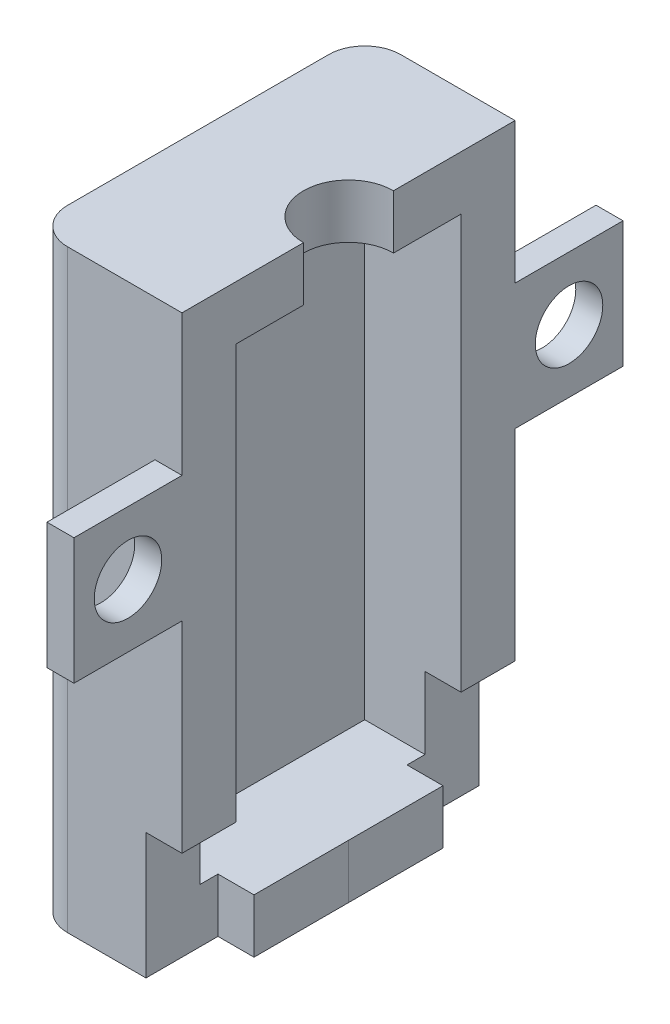
ISO-10303-21;
HEADER;
FILE_DESCRIPTION(('STEP AP214'),'2;1');
FILE_NAME('part.step','',(''),(''),'','','');
FILE_SCHEMA(('AUTOMOTIVE_DESIGN { 1 0 10303 214 1 1 1 1 }'));
ENDSEC;
DATA;
#1=APPLICATION_CONTEXT('core data for automotive mechanical design processes');
#2=APPLICATION_PROTOCOL_DEFINITION('international standard','automotive_design',2000,#1);
#3=PRODUCT_CONTEXT('',#1,'mechanical');
#4=PRODUCT('Part','Part','',(#3));
#5=PRODUCT_RELATED_PRODUCT_CATEGORY('part','',(#4));
#6=PRODUCT_DEFINITION_FORMATION('','',#4);
#7=PRODUCT_DEFINITION_CONTEXT('part definition',#1,'design');
#8=PRODUCT_DEFINITION('design','',#6,#7);
#9=PRODUCT_DEFINITION_SHAPE('','',#8);
#10=(LENGTH_UNIT() NAMED_UNIT(*) SI_UNIT(.MILLI.,.METRE.));
#11=(NAMED_UNIT(*) PLANE_ANGLE_UNIT() SI_UNIT($,.RADIAN.));
#12=(NAMED_UNIT(*) SI_UNIT($,.STERADIAN.) SOLID_ANGLE_UNIT());
#13=UNCERTAINTY_MEASURE_WITH_UNIT(LENGTH_MEASURE(1.E-05),#10,'distance_accuracy_value','');
#14=(GEOMETRIC_REPRESENTATION_CONTEXT(3) GLOBAL_UNCERTAINTY_ASSIGNED_CONTEXT((#13)) GLOBAL_UNIT_ASSIGNED_CONTEXT((#10,
#11,#12)) REPRESENTATION_CONTEXT('',''));
#15=CARTESIAN_POINT('',(0.,0.,0.));
#16=DIRECTION('',(0.,0.,1.));
#17=DIRECTION('',(1.,0.,0.));
#18=AXIS2_PLACEMENT_3D('',#15,#16,#17);
#19=CARTESIAN_POINT('',(-8.35,3.,9.25));
#20=DIRECTION('',(0.,0.,-1.));
#21=DIRECTION('',(-1.,0.,0.));
#22=AXIS2_PLACEMENT_3D('',#19,#20,#21);
#23=PLANE('',#22);
#24=DIRECTION('',(0.,-1.,0.));
#25=VECTOR('',#24,1.);
#26=CARTESIAN_POINT('',(0.,3.,9.25));
#27=LINE('',#26,#25);
#28=CARTESIAN_POINT('',(0.,33.,9.25));
#29=VERTEX_POINT('',#28);
#30=CARTESIAN_POINT('',(0.,25.1794134746916,9.25));
#31=VERTEX_POINT('',#30);
#32=EDGE_CURVE('E414',#29,#31,#27,.T.);
#33=ORIENTED_EDGE('',*,*,#32,.F.);
#34=DIRECTION('',(1.,0.,0.));
#35=VECTOR('',#34,1.);
#36=CARTESIAN_POINT('',(-8.35,33.,9.25));
#37=LINE('',#36,#35);
#38=CARTESIAN_POINT('',(-6.35,33.,9.25));
#39=VERTEX_POINT('',#38);
#40=EDGE_CURVE('E264',#39,#29,#37,.T.);
#41=ORIENTED_EDGE('',*,*,#40,.F.);
#42=DIRECTION('',(0.,-1.,0.));
#43=VECTOR('',#42,1.);
#44=CARTESIAN_POINT('',(-6.35,3.,9.25));
#45=LINE('',#44,#43);
#46=CARTESIAN_POINT('',(-6.35,0.,9.25));
#47=VERTEX_POINT('',#46);
#48=EDGE_CURVE('E45',#39,#47,#45,.T.);
#49=ORIENTED_EDGE('',*,*,#48,.T.);
#50=DIRECTION('',(1.,0.,0.));
#51=VECTOR('',#50,1.);
#52=CARTESIAN_POINT('',(-8.35,0.,9.25));
#53=LINE('',#52,#51);
#54=CARTESIAN_POINT('',(-2.,0.,9.25));
#55=VERTEX_POINT('',#54);
#56=EDGE_CURVE('E332',#47,#55,#53,.T.);
#57=ORIENTED_EDGE('',*,*,#56,.T.);
#58=DIRECTION('',(0.,1.,0.));
#59=VECTOR('',#58,1.);
#60=CARTESIAN_POINT('',(-2.,3.,9.25));
#61=LINE('',#60,#59);
#62=CARTESIAN_POINT('',(-2.,7.,9.25));
#63=VERTEX_POINT('',#62);
#64=EDGE_CURVE('E299',#55,#63,#61,.T.);
#65=ORIENTED_EDGE('',*,*,#64,.T.);
#66=DIRECTION('',(-1.,0.,0.));
#67=VECTOR('',#66,1.);
#68=CARTESIAN_POINT('',(-8.35,7.,9.25));
#69=LINE('',#68,#67);
#70=CARTESIAN_POINT('',(0.,7.,9.25));
#71=VERTEX_POINT('',#70);
#72=EDGE_CURVE('E302',#71,#63,#69,.T.);
#73=ORIENTED_EDGE('',*,*,#72,.F.);
#74=CARTESIAN_POINT('',(0.,18.1794134746916,9.25));
#75=VERTEX_POINT('',#74);
#76=EDGE_CURVE('E412',#75,#71,#27,.T.);
#77=ORIENTED_EDGE('',*,*,#76,.F.);
#78=DIRECTION('',(1.,0.,0.));
#79=VECTOR('',#78,1.);
#80=CARTESIAN_POINT('',(-1.5,18.1794134746916,9.25));
#81=LINE('',#80,#79);
#82=CARTESIAN_POINT('',(-1.5,18.1794134746916,9.25));
#83=VERTEX_POINT('',#82);
#84=EDGE_CURVE('E452',#83,#75,#81,.T.);
#85=ORIENTED_EDGE('',*,*,#84,.F.);
#86=DIRECTION('',(0.,-1.,0.));
#87=VECTOR('',#86,1.);
#88=CARTESIAN_POINT('',(-1.5,25.1794134746916,9.25));
#89=LINE('',#88,#87);
#90=CARTESIAN_POINT('',(-1.5,25.1794134746916,9.25));
#91=VERTEX_POINT('',#90);
#92=EDGE_CURVE('E459',#91,#83,#89,.T.);
#93=ORIENTED_EDGE('',*,*,#92,.F.);
#94=DIRECTION('',(-1.,0.,0.));
#95=VECTOR('',#94,1.);
#96=CARTESIAN_POINT('',(-1.5,25.1794134746916,9.25));
#97=LINE('',#96,#95);
#98=EDGE_CURVE('E367',#31,#91,#97,.T.);
#99=ORIENTED_EDGE('',*,*,#98,.F.);
#100=EDGE_LOOP('',(#33,#41,#49,#57,#65,#73,#77,#85,#93,#99));
#101=FACE_BOUND('',#100,.T.);
#102=ADVANCED_FACE('F37',(#101),#23,.F.);
#103=CARTESIAN_POINT('',(-8.35,3.,-9.25));
#104=DIRECTION('',(0.,0.,1.));
#105=DIRECTION('',(1.,0.,0.));
#106=AXIS2_PLACEMENT_3D('',#103,#104,#105);
#107=PLANE('',#106);
#108=DIRECTION('',(0.,1.,0.));
#109=VECTOR('',#108,1.);
#110=CARTESIAN_POINT('',(0.,3.,-9.25));
#111=LINE('',#110,#109);
#112=CARTESIAN_POINT('',(0.,7.,-9.25));
#113=VERTEX_POINT('',#112);
#114=CARTESIAN_POINT('',(0.,18.1794134746916,-9.25));
#115=VERTEX_POINT('',#114);
#116=EDGE_CURVE('E240',#113,#115,#111,.T.);
#117=ORIENTED_EDGE('',*,*,#116,.F.);
#118=DIRECTION('',(-1.,0.,0.));
#119=VECTOR('',#118,1.);
#120=CARTESIAN_POINT('',(-8.35,7.,-9.25));
#121=LINE('',#120,#119);
#122=CARTESIAN_POINT('',(-2.,7.,-9.25));
#123=VERTEX_POINT('',#122);
#124=EDGE_CURVE('E304',#113,#123,#121,.T.);
#125=ORIENTED_EDGE('',*,*,#124,.T.);
#126=DIRECTION('',(0.,-1.,0.));
#127=VECTOR('',#126,1.);
#128=CARTESIAN_POINT('',(-2.,3.,-9.25));
#129=LINE('',#128,#127);
#130=CARTESIAN_POINT('',(-2.,0.,-9.25));
#131=VERTEX_POINT('',#130);
#132=EDGE_CURVE('E293',#123,#131,#129,.T.);
#133=ORIENTED_EDGE('',*,*,#132,.T.);
#134=DIRECTION('',(-1.,0.,0.));
#135=VECTOR('',#134,1.);
#136=CARTESIAN_POINT('',(-8.35,0.,-9.25));
#137=LINE('',#136,#135);
#138=CARTESIAN_POINT('',(-6.35,0.,-9.25));
#139=VERTEX_POINT('',#138);
#140=EDGE_CURVE('E327',#131,#139,#137,.T.);
#141=ORIENTED_EDGE('',*,*,#140,.T.);
#142=DIRECTION('',(0.,-1.,0.));
#143=VECTOR('',#142,1.);
#144=CARTESIAN_POINT('',(-6.35,3.,-9.25));
#145=LINE('',#144,#143);
#146=CARTESIAN_POINT('',(-6.35,33.,-9.25));
#147=VERTEX_POINT('',#146);
#148=EDGE_CURVE('E258',#139,#147,#145,.F.);
#149=ORIENTED_EDGE('',*,*,#148,.T.);
#150=DIRECTION('',(-1.,0.,0.));
#151=VECTOR('',#150,1.);
#152=CARTESIAN_POINT('',(-8.35,33.,-9.25));
#153=LINE('',#152,#151);
#154=CARTESIAN_POINT('',(0.,33.,-9.25));
#155=VERTEX_POINT('',#154);
#156=EDGE_CURVE('E247',#155,#147,#153,.T.);
#157=ORIENTED_EDGE('',*,*,#156,.F.);
#158=CARTESIAN_POINT('',(0.,25.1794134746916,-9.25));
#159=VERTEX_POINT('',#158);
#160=EDGE_CURVE('E230',#159,#155,#111,.T.);
#161=ORIENTED_EDGE('',*,*,#160,.F.);
#162=DIRECTION('',(-1.,0.,0.));
#163=VECTOR('',#162,1.);
#164=CARTESIAN_POINT('',(-1.5,25.1794134746916,-9.25));
#165=LINE('',#164,#163);
#166=CARTESIAN_POINT('',(-1.5,25.1794134746916,-9.25));
#167=VERTEX_POINT('',#166);
#168=EDGE_CURVE('E434',#159,#167,#165,.T.);
#169=ORIENTED_EDGE('',*,*,#168,.T.);
#170=DIRECTION('',(0.,-1.,0.));
#171=VECTOR('',#170,1.);
#172=CARTESIAN_POINT('',(-1.5,25.1794134746916,-9.25));
#173=LINE('',#172,#171);
#174=CARTESIAN_POINT('',(-1.5,18.1794134746916,-9.25));
#175=VERTEX_POINT('',#174);
#176=EDGE_CURVE('E442',#167,#175,#173,.T.);
#177=ORIENTED_EDGE('',*,*,#176,.T.);
#178=DIRECTION('',(1.,0.,0.));
#179=VECTOR('',#178,1.);
#180=CARTESIAN_POINT('',(-1.5,18.1794134746916,-9.25));
#181=LINE('',#180,#179);
#182=EDGE_CURVE('E371',#175,#115,#181,.T.);
#183=ORIENTED_EDGE('',*,*,#182,.T.);
#184=EDGE_LOOP('',(#117,#125,#133,#141,#149,#157,#161,#169,#177,#183));
#185=FACE_BOUND('',#184,.T.);
#186=ADVANCED_FACE('F255',(#185),#107,.F.);
#187=CARTESIAN_POINT('',(0.,0.,0.));
#188=DIRECTION('',(0.,-1.,0.));
#189=DIRECTION('',(0.,0.,-1.));
#190=AXIS2_PLACEMENT_3D('',#187,#188,#189);
#191=PLANE('',#190);
#192=DIRECTION('',(0.,0.,1.));
#193=VECTOR('',#192,1.);
#194=CARTESIAN_POINT('',(0.,0.,0.));
#195=LINE('',#194,#193);
#196=CARTESIAN_POINT('',(0.,0.,-5.25));
#197=VERTEX_POINT('',#196);
#198=CARTESIAN_POINT('',(0.,0.,0.));
#199=VERTEX_POINT('',#198);
#200=EDGE_CURVE('E52',#197,#199,#195,.T.);
#201=ORIENTED_EDGE('',*,*,#200,.T.);
#202=DIRECTION('',(0.,0.,1.));
#203=VECTOR('',#202,1.);
#204=CARTESIAN_POINT('',(0.,0.,0.));
#205=LINE('',#204,#203);
#206=CARTESIAN_POINT('',(0.,0.,5.25));
#207=VERTEX_POINT('',#206);
#208=EDGE_CURVE('E372',#199,#207,#205,.T.);
#209=ORIENTED_EDGE('',*,*,#208,.T.);
#210=DIRECTION('',(1.,0.,0.));
#211=VECTOR('',#210,1.);
#212=CARTESIAN_POINT('',(-2.,0.,5.25));
#213=LINE('',#212,#211);
#214=CARTESIAN_POINT('',(-2.,0.,5.25));
#215=VERTEX_POINT('',#214);
#216=EDGE_CURVE('E276',#215,#207,#213,.T.);
#217=ORIENTED_EDGE('',*,*,#216,.F.);
#218=DIRECTION('',(0.,0.,-1.));
#219=VECTOR('',#218,1.);
#220=CARTESIAN_POINT('',(-2.,0.,13.25));
#221=LINE('',#220,#219);
#222=EDGE_CURVE('E277',#55,#215,#221,.T.);
#223=ORIENTED_EDGE('',*,*,#222,.F.);
#224=ORIENTED_EDGE('',*,*,#56,.F.);
#225=CARTESIAN_POINT('',(-6.35,0.,7.25));
#226=DIRECTION('',(0.,-1.,0.));
#227=DIRECTION('',(0.,0.,-1.));
#228=AXIS2_PLACEMENT_3D('',#225,#226,#227);
#229=CIRCLE('',#228,2.);
#230=CARTESIAN_POINT('',(-8.35,0.,7.25));
#231=VERTEX_POINT('',#230);
#232=EDGE_CURVE('E349',#47,#231,#229,.T.);
#233=ORIENTED_EDGE('',*,*,#232,.T.);
#234=DIRECTION('',(0.,0.,1.));
#235=VECTOR('',#234,1.);
#236=CARTESIAN_POINT('',(-8.35,0.,9.25));
#237=LINE('',#236,#235);
#238=CARTESIAN_POINT('',(-8.35,0.,-7.25));
#239=VERTEX_POINT('',#238);
#240=EDGE_CURVE('E329',#239,#231,#237,.T.);
#241=ORIENTED_EDGE('',*,*,#240,.F.);
#242=CARTESIAN_POINT('',(-6.35,0.,-7.25));
#243=DIRECTION('',(0.,-1.,0.));
#244=DIRECTION('',(0.,0.,-1.));
#245=AXIS2_PLACEMENT_3D('',#242,#243,#244);
#246=CIRCLE('',#245,2.);
#247=EDGE_CURVE('E351',#239,#139,#246,.T.);
#248=ORIENTED_EDGE('',*,*,#247,.T.);
#249=ORIENTED_EDGE('',*,*,#140,.F.);
#250=DIRECTION('',(0.,0.,-1.));
#251=VECTOR('',#250,1.);
#252=CARTESIAN_POINT('',(-2.,0.,-13.25));
#253=LINE('',#252,#251);
#254=CARTESIAN_POINT('',(-2.,0.,-5.25));
#255=VERTEX_POINT('',#254);
#256=EDGE_CURVE('E287',#255,#131,#253,.T.);
#257=ORIENTED_EDGE('',*,*,#256,.F.);
#258=DIRECTION('',(-1.,0.,0.));
#259=VECTOR('',#258,1.);
#260=CARTESIAN_POINT('',(-2.,0.,-5.25));
#261=LINE('',#260,#259);
#262=EDGE_CURVE('E271',#197,#255,#261,.T.);
#263=ORIENTED_EDGE('',*,*,#262,.F.);
#264=EDGE_LOOP('',(#201,#209,#217,#223,#224,#233,#241,#248,#249,#257,#263));
#265=FACE_BOUND('',#264,.T.);
#266=ADVANCED_FACE('F500',(#265),#191,.T.);
#267=CARTESIAN_POINT('',(-5.35,30.,-6.25));
#268=DIRECTION('',(0.,0.,1.));
#269=DIRECTION('',(1.,0.,0.));
#270=AXIS2_PLACEMENT_3D('',#267,#268,#269);
#271=PLANE('',#270);
#272=DIRECTION('',(-1.,0.,0.));
#273=VECTOR('',#272,1.);
#274=CARTESIAN_POINT('',(-5.35,7.,-6.25));
#275=LINE('',#274,#273);
#276=CARTESIAN_POINT('',(0.,7.,-6.25));
#277=VERTEX_POINT('',#276);
#278=CARTESIAN_POINT('',(-2.,7.,-6.25));
#279=VERTEX_POINT('',#278);
#280=EDGE_CURVE('E346',#277,#279,#275,.T.);
#281=ORIENTED_EDGE('',*,*,#280,.F.);
#282=DIRECTION('',(0.,1.,0.));
#283=VECTOR('',#282,1.);
#284=CARTESIAN_POINT('',(0.,30.,-6.25));
#285=LINE('',#284,#283);
#286=CARTESIAN_POINT('',(0.,30.,-6.25));
#287=VERTEX_POINT('',#286);
#288=EDGE_CURVE('E392',#277,#287,#285,.T.);
#289=ORIENTED_EDGE('',*,*,#288,.T.);
#290=DIRECTION('',(-1.,0.,0.));
#291=VECTOR('',#290,1.);
#292=CARTESIAN_POINT('',(-5.35,30.,-6.25));
#293=LINE('',#292,#291);
#294=CARTESIAN_POINT('',(-5.35,30.,-6.25));
#295=VERTEX_POINT('',#294);
#296=EDGE_CURVE('E307',#287,#295,#293,.T.);
#297=ORIENTED_EDGE('',*,*,#296,.T.);
#298=DIRECTION('',(0.,-1.,0.));
#299=VECTOR('',#298,1.);
#300=CARTESIAN_POINT('',(-5.35,30.,-6.25));
#301=LINE('',#300,#299);
#302=CARTESIAN_POINT('',(-5.35,3.,-6.25));
#303=VERTEX_POINT('',#302);
#304=EDGE_CURVE('E324',#295,#303,#301,.T.);
#305=ORIENTED_EDGE('',*,*,#304,.T.);
#306=DIRECTION('',(-1.,0.,0.));
#307=VECTOR('',#306,1.);
#308=CARTESIAN_POINT('',(-5.35,3.,-6.25));
#309=LINE('',#308,#307);
#310=CARTESIAN_POINT('',(-2.,3.,-6.25));
#311=VERTEX_POINT('',#310);
#312=EDGE_CURVE('E306',#311,#303,#309,.T.);
#313=ORIENTED_EDGE('',*,*,#312,.F.);
#314=DIRECTION('',(0.,-1.,0.));
#315=VECTOR('',#314,1.);
#316=CARTESIAN_POINT('',(-2.,30.,-6.25));
#317=LINE('',#316,#315);
#318=EDGE_CURVE('E283',#279,#311,#317,.T.);
#319=ORIENTED_EDGE('',*,*,#318,.F.);
#320=EDGE_LOOP('',(#281,#289,#297,#305,#313,#319));
#321=FACE_BOUND('',#320,.T.);
#322=ADVANCED_FACE('F484',(#321),#271,.T.);
#323=CARTESIAN_POINT('',(-5.35,30.,6.25));
#324=DIRECTION('',(0.,0.,-1.));
#325=DIRECTION('',(-1.,0.,0.));
#326=AXIS2_PLACEMENT_3D('',#323,#324,#325);
#327=PLANE('',#326);
#328=DIRECTION('',(1.,0.,0.));
#329=VECTOR('',#328,1.);
#330=CARTESIAN_POINT('',(-5.35,30.,6.25));
#331=LINE('',#330,#329);
#332=CARTESIAN_POINT('',(-5.35,30.,6.25));
#333=VERTEX_POINT('',#332);
#334=CARTESIAN_POINT('',(0.,30.,6.25));
#335=VERTEX_POINT('',#334);
#336=EDGE_CURVE('E313',#333,#335,#331,.T.);
#337=ORIENTED_EDGE('',*,*,#336,.T.);
#338=DIRECTION('',(0.,-1.,0.));
#339=VECTOR('',#338,1.);
#340=CARTESIAN_POINT('',(0.,30.,6.25));
#341=LINE('',#340,#339);
#342=CARTESIAN_POINT('',(0.,7.,6.25));
#343=VERTEX_POINT('',#342);
#344=EDGE_CURVE('E418',#335,#343,#341,.T.);
#345=ORIENTED_EDGE('',*,*,#344,.T.);
#346=DIRECTION('',(-1.,0.,0.));
#347=VECTOR('',#346,1.);
#348=CARTESIAN_POINT('',(-5.35,7.,6.25));
#349=LINE('',#348,#347);
#350=CARTESIAN_POINT('',(-2.,7.,6.25));
#351=VERTEX_POINT('',#350);
#352=EDGE_CURVE('E344',#343,#351,#349,.T.);
#353=ORIENTED_EDGE('',*,*,#352,.T.);
#354=DIRECTION('',(0.,1.,0.));
#355=VECTOR('',#354,1.);
#356=CARTESIAN_POINT('',(-2.,30.,6.25));
#357=LINE('',#356,#355);
#358=CARTESIAN_POINT('',(-2.,3.,6.25));
#359=VERTEX_POINT('',#358);
#360=EDGE_CURVE('E296',#359,#351,#357,.T.);
#361=ORIENTED_EDGE('',*,*,#360,.F.);
#362=DIRECTION('',(1.,0.,0.));
#363=VECTOR('',#362,1.);
#364=CARTESIAN_POINT('',(-5.35,3.,6.25));
#365=LINE('',#364,#363);
#366=CARTESIAN_POINT('',(-5.35,3.,6.25));
#367=VERTEX_POINT('',#366);
#368=EDGE_CURVE('E310',#367,#359,#365,.T.);
#369=ORIENTED_EDGE('',*,*,#368,.F.);
#370=DIRECTION('',(0.,-1.,0.));
#371=VECTOR('',#370,1.);
#372=CARTESIAN_POINT('',(-5.35,30.,6.25));
#373=LINE('',#372,#371);
#374=EDGE_CURVE('E316',#333,#367,#373,.T.);
#375=ORIENTED_EDGE('',*,*,#374,.F.);
#376=EDGE_LOOP('',(#337,#345,#353,#361,#369,#375));
#377=FACE_BOUND('',#376,.T.);
#378=ADVANCED_FACE('F579',(#377),#327,.T.);
#379=CARTESIAN_POINT('',(0.,3.,0.));
#380=DIRECTION('',(0.,-1.,0.));
#381=DIRECTION('',(0.,0.,-1.));
#382=AXIS2_PLACEMENT_3D('',#379,#380,#381);
#383=PLANE('',#382);
#384=DIRECTION('',(0.,0.,1.));
#385=VECTOR('',#384,1.);
#386=CARTESIAN_POINT('',(0.,3.,0.));
#387=LINE('',#386,#385);
#388=CARTESIAN_POINT('',(0.,3.,0.));
#389=VERTEX_POINT('',#388);
#390=CARTESIAN_POINT('',(0.,3.,5.25));
#391=VERTEX_POINT('',#390);
#392=EDGE_CURVE('E60',#389,#391,#387,.T.);
#393=ORIENTED_EDGE('',*,*,#392,.F.);
#394=DIRECTION('',(0.,0.,1.));
#395=VECTOR('',#394,1.);
#396=CARTESIAN_POINT('',(0.,3.,0.));
#397=LINE('',#396,#395);
#398=CARTESIAN_POINT('',(0.,3.,-5.25));
#399=VERTEX_POINT('',#398);
#400=EDGE_CURVE('E402',#399,#389,#397,.T.);
#401=ORIENTED_EDGE('',*,*,#400,.F.);
#402=DIRECTION('',(-1.,0.,0.));
#403=VECTOR('',#402,1.);
#404=CARTESIAN_POINT('',(0.,3.,-5.25));
#405=LINE('',#404,#403);
#406=CARTESIAN_POINT('',(-2.,3.,-5.25));
#407=VERTEX_POINT('',#406);
#408=EDGE_CURVE('E334',#399,#407,#405,.T.);
#409=ORIENTED_EDGE('',*,*,#408,.T.);
#410=DIRECTION('',(0.,0.,-1.));
#411=VECTOR('',#410,1.);
#412=CARTESIAN_POINT('',(-2.,3.,0.));
#413=LINE('',#412,#411);
#414=EDGE_CURVE('E336',#407,#311,#413,.T.);
#415=ORIENTED_EDGE('',*,*,#414,.T.);
#416=ORIENTED_EDGE('',*,*,#312,.T.);
#417=DIRECTION('',(0.,0.,1.));
#418=VECTOR('',#417,1.);
#419=CARTESIAN_POINT('',(-5.35,3.,6.25));
#420=LINE('',#419,#418);
#421=EDGE_CURVE('E318',#303,#367,#420,.T.);
#422=ORIENTED_EDGE('',*,*,#421,.T.);
#423=ORIENTED_EDGE('',*,*,#368,.T.);
#424=DIRECTION('',(0.,0.,-1.));
#425=VECTOR('',#424,1.);
#426=CARTESIAN_POINT('',(-2.,3.,0.));
#427=LINE('',#426,#425);
#428=CARTESIAN_POINT('',(-2.,3.,5.25));
#429=VERTEX_POINT('',#428);
#430=EDGE_CURVE('E339',#359,#429,#427,.T.);
#431=ORIENTED_EDGE('',*,*,#430,.T.);
#432=DIRECTION('',(1.,0.,0.));
#433=VECTOR('',#432,1.);
#434=CARTESIAN_POINT('',(0.,3.,5.25));
#435=LINE('',#434,#433);
#436=EDGE_CURVE('E342',#429,#391,#435,.T.);
#437=ORIENTED_EDGE('',*,*,#436,.T.);
#438=EDGE_LOOP('',(#393,#401,#409,#415,#416,#422,#423,#431,#437));
#439=FACE_BOUND('',#438,.T.);
#440=ADVANCED_FACE('F573',(#439),#383,.F.);
#441=CARTESIAN_POINT('',(0.,7.,0.));
#442=DIRECTION('',(0.,1.,0.));
#443=DIRECTION('',(0.,0.,1.));
#444=AXIS2_PLACEMENT_3D('',#441,#442,#443);
#445=PLANE('',#444);
#446=DIRECTION('',(0.,0.,-1.));
#447=VECTOR('',#446,1.);
#448=CARTESIAN_POINT('',(0.,7.,0.));
#449=LINE('',#448,#447);
#450=EDGE_CURVE('E390',#277,#113,#449,.T.);
#451=ORIENTED_EDGE('',*,*,#450,.F.);
#452=ORIENTED_EDGE('',*,*,#280,.T.);
#453=DIRECTION('',(0.,0.,-1.));
#454=VECTOR('',#453,1.);
#455=CARTESIAN_POINT('',(-2.,7.,-13.25));
#456=LINE('',#455,#454);
#457=EDGE_CURVE('E284',#279,#123,#456,.T.);
#458=ORIENTED_EDGE('',*,*,#457,.T.);
#459=ORIENTED_EDGE('',*,*,#124,.F.);
#460=EDGE_LOOP('',(#451,#452,#458,#459));
#461=FACE_BOUND('',#460,.T.);
#462=ADVANCED_FACE('F491',(#461),#445,.F.);
#463=CARTESIAN_POINT('',(-2.,7.,-5.25));
#464=DIRECTION('',(0.,0.,1.));
#465=DIRECTION('',(1.,0.,0.));
#466=AXIS2_PLACEMENT_3D('',#463,#464,#465);
#467=PLANE('',#466);
#468=DIRECTION('',(0.,1.,0.));
#469=VECTOR('',#468,1.);
#470=CARTESIAN_POINT('',(0.,7.,-5.25));
#471=LINE('',#470,#469);
#472=EDGE_CURVE('E399',#197,#399,#471,.T.);
#473=ORIENTED_EDGE('',*,*,#472,.F.);
#474=ORIENTED_EDGE('',*,*,#262,.T.);
#475=DIRECTION('',(0.,-1.,0.));
#476=VECTOR('',#475,1.);
#477=CARTESIAN_POINT('',(-2.,7.,-5.25));
#478=LINE('',#477,#476);
#479=EDGE_CURVE('E280',#407,#255,#478,.T.);
#480=ORIENTED_EDGE('',*,*,#479,.F.);
#481=ORIENTED_EDGE('',*,*,#408,.F.);
#482=EDGE_LOOP('',(#473,#474,#480,#481));
#483=FACE_BOUND('',#482,.T.);
#484=ADVANCED_FACE('F572',(#483),#467,.F.);
#485=CARTESIAN_POINT('',(0.,7.,0.));
#486=DIRECTION('',(0.,-1.,0.));
#487=DIRECTION('',(0.,0.,-1.));
#488=AXIS2_PLACEMENT_3D('',#485,#486,#487);
#489=PLANE('',#488);
#490=ORIENTED_EDGE('',*,*,#352,.F.);
#491=DIRECTION('',(0.,0.,1.));
#492=VECTOR('',#491,1.);
#493=CARTESIAN_POINT('',(0.,7.,0.));
#494=LINE('',#493,#492);
#495=EDGE_CURVE('E415',#343,#71,#494,.T.);
#496=ORIENTED_EDGE('',*,*,#495,.T.);
#497=ORIENTED_EDGE('',*,*,#72,.T.);
#498=DIRECTION('',(0.,0.,-1.));
#499=VECTOR('',#498,1.);
#500=CARTESIAN_POINT('',(-2.,7.,13.25));
#501=LINE('',#500,#499);
#502=EDGE_CURVE('E272',#63,#351,#501,.T.);
#503=ORIENTED_EDGE('',*,*,#502,.T.);
#504=EDGE_LOOP('',(#490,#496,#497,#503));
#505=FACE_BOUND('',#504,.T.);
#506=ADVANCED_FACE('F577',(#505),#489,.T.);
#507=CARTESIAN_POINT('',(-2.,7.,5.25));
#508=DIRECTION('',(0.,0.,-1.));
#509=DIRECTION('',(-1.,0.,0.));
#510=AXIS2_PLACEMENT_3D('',#507,#508,#509);
#511=PLANE('',#510);
#512=DIRECTION('',(0.,-1.,0.));
#513=VECTOR('',#512,1.);
#514=CARTESIAN_POINT('',(0.,7.,5.25));
#515=LINE('',#514,#513);
#516=EDGE_CURVE('E425',#391,#207,#515,.T.);
#517=ORIENTED_EDGE('',*,*,#516,.F.);
#518=ORIENTED_EDGE('',*,*,#436,.F.);
#519=DIRECTION('',(0.,-1.,0.));
#520=VECTOR('',#519,1.);
#521=CARTESIAN_POINT('',(-2.,7.,5.25));
#522=LINE('',#521,#520);
#523=EDGE_CURVE('E275',#429,#215,#522,.T.);
#524=ORIENTED_EDGE('',*,*,#523,.T.);
#525=ORIENTED_EDGE('',*,*,#216,.T.);
#526=EDGE_LOOP('',(#517,#518,#524,#525));
#527=FACE_BOUND('',#526,.T.);
#528=ADVANCED_FACE('F569',(#527),#511,.F.);
#529=CARTESIAN_POINT('',(0.,30.,0.));
#530=DIRECTION('',(0.,1.,0.));
#531=DIRECTION('',(0.,0.,1.));
#532=AXIS2_PLACEMENT_3D('',#529,#530,#531);
#533=PLANE('',#532);
#534=DIRECTION('',(0.,0.,-1.));
#535=VECTOR('',#534,1.);
#536=CARTESIAN_POINT('',(0.,30.,0.));
#537=LINE('',#536,#535);
#538=CARTESIAN_POINT('',(0.,30.,2.5));
#539=VERTEX_POINT('',#538);
#540=EDGE_CURVE('E421',#335,#539,#537,.T.);
#541=ORIENTED_EDGE('',*,*,#540,.F.);
#542=ORIENTED_EDGE('',*,*,#336,.F.);
#543=DIRECTION('',(0.,0.,1.));
#544=VECTOR('',#543,1.);
#545=CARTESIAN_POINT('',(-5.35,30.,6.25));
#546=LINE('',#545,#544);
#547=EDGE_CURVE('E309',#295,#333,#546,.T.);
#548=ORIENTED_EDGE('',*,*,#547,.F.);
#549=ORIENTED_EDGE('',*,*,#296,.F.);
#550=DIRECTION('',(0.,0.,-1.));
#551=VECTOR('',#550,1.);
#552=CARTESIAN_POINT('',(0.,30.,0.));
#553=LINE('',#552,#551);
#554=CARTESIAN_POINT('',(0.,30.,-2.5));
#555=VERTEX_POINT('',#554);
#556=EDGE_CURVE('E395',#555,#287,#553,.T.);
#557=ORIENTED_EDGE('',*,*,#556,.F.);
#558=CARTESIAN_POINT('',(0.,30.,0.));
#559=DIRECTION('',(0.,1.,0.));
#560=DIRECTION('',(0.,0.,1.));
#561=AXIS2_PLACEMENT_3D('',#558,#559,#560);
#562=CIRCLE('',#561,2.5);
#563=EDGE_CURVE('E261',#555,#539,#562,.T.);
#564=ORIENTED_EDGE('',*,*,#563,.T.);
#565=EDGE_LOOP('',(#541,#542,#548,#549,#557,#564));
#566=FACE_BOUND('',#565,.T.);
#567=ADVANCED_FACE('F479',(#566),#533,.F.);
#568=CARTESIAN_POINT('',(0.,33.,0.));
#569=DIRECTION('',(0.,1.,0.));
#570=DIRECTION('',(0.,0.,1.));
#571=AXIS2_PLACEMENT_3D('',#568,#569,#570);
#572=PLANE('',#571);
#573=ORIENTED_EDGE('',*,*,#40,.T.);
#574=DIRECTION('',(0.,0.,1.));
#575=VECTOR('',#574,1.);
#576=CARTESIAN_POINT('',(0.,33.,0.));
#577=LINE('',#576,#575);
#578=CARTESIAN_POINT('',(0.,33.,2.5));
#579=VERTEX_POINT('',#578);
#580=EDGE_CURVE('E376',#579,#29,#577,.T.);
#581=ORIENTED_EDGE('',*,*,#580,.F.);
#582=CARTESIAN_POINT('',(0.,33.,0.));
#583=DIRECTION('',(0.,1.,0.));
#584=DIRECTION('',(0.,0.,1.));
#585=AXIS2_PLACEMENT_3D('',#582,#583,#584);
#586=CIRCLE('',#585,2.5);
#587=CARTESIAN_POINT('',(0.,33.,-2.5));
#588=VERTEX_POINT('',#587);
#589=EDGE_CURVE('E251',#588,#579,#586,.T.);
#590=ORIENTED_EDGE('',*,*,#589,.F.);
#591=DIRECTION('',(0.,0.,1.));
#592=VECTOR('',#591,1.);
#593=CARTESIAN_POINT('',(0.,33.,0.));
#594=LINE('',#593,#592);
#595=EDGE_CURVE('E233',#155,#588,#594,.T.);
#596=ORIENTED_EDGE('',*,*,#595,.F.);
#597=ORIENTED_EDGE('',*,*,#156,.T.);
#598=CARTESIAN_POINT('',(-6.35,33.,-7.25));
#599=DIRECTION('',(0.,1.,0.));
#600=DIRECTION('',(0.,0.,1.));
#601=AXIS2_PLACEMENT_3D('',#598,#599,#600);
#602=CIRCLE('',#601,2.);
#603=CARTESIAN_POINT('',(-8.35,33.,-7.25));
#604=VERTEX_POINT('',#603);
#605=EDGE_CURVE('E355',#147,#604,#602,.T.);
#606=ORIENTED_EDGE('',*,*,#605,.T.);
#607=DIRECTION('',(0.,0.,1.));
#608=VECTOR('',#607,1.);
#609=CARTESIAN_POINT('',(-8.35,33.,-9.25));
#610=LINE('',#609,#608);
#611=CARTESIAN_POINT('',(-8.35,33.,7.25));
#612=VERTEX_POINT('',#611);
#613=EDGE_CURVE('E260',#604,#612,#610,.T.);
#614=ORIENTED_EDGE('',*,*,#613,.T.);
#615=CARTESIAN_POINT('',(-6.35,33.,7.25));
#616=DIRECTION('',(0.,1.,0.));
#617=DIRECTION('',(0.,0.,1.));
#618=AXIS2_PLACEMENT_3D('',#615,#616,#617);
#619=CIRCLE('',#618,2.);
#620=EDGE_CURVE('E353',#612,#39,#619,.T.);
#621=ORIENTED_EDGE('',*,*,#620,.T.);
#622=EDGE_LOOP('',(#573,#581,#590,#596,#597,#606,#614,#621));
#623=FACE_BOUND('',#622,.T.);
#624=ADVANCED_FACE('F246',(#623),#572,.T.);
#625=CARTESIAN_POINT('',(0.,30.,0.));
#626=DIRECTION('',(0.,1.,0.));
#627=DIRECTION('',(0.,0.,1.));
#628=AXIS2_PLACEMENT_3D('',#625,#626,#627);
#629=CYLINDRICAL_SURFACE('',#628,2.5);
#630=DIRECTION('',(0.,1.,0.));
#631=VECTOR('',#630,1.);
#632=CARTESIAN_POINT('',(0.,30.,2.5));
#633=LINE('',#632,#631);
#634=EDGE_CURVE('E423',#539,#579,#633,.T.);
#635=ORIENTED_EDGE('',*,*,#634,.F.);
#636=ORIENTED_EDGE('',*,*,#563,.F.);
#637=DIRECTION('',(0.,1.,0.));
#638=VECTOR('',#637,1.);
#639=CARTESIAN_POINT('',(0.,30.,-2.5));
#640=LINE('',#639,#638);
#641=EDGE_CURVE('E397',#588,#555,#640,.F.);
#642=ORIENTED_EDGE('',*,*,#641,.F.);
#643=ORIENTED_EDGE('',*,*,#589,.T.);
#644=EDGE_LOOP('',(#635,#636,#642,#643));
#645=FACE_BOUND('',#644,.T.);
#646=ADVANCED_FACE('F473',(#645),#629,.F.);
#647=CARTESIAN_POINT('',(-1.5,25.1794134746916,15.25));
#648=DIRECTION('',(0.,-1.,0.));
#649=DIRECTION('',(0.,0.,-1.));
#650=AXIS2_PLACEMENT_3D('',#647,#648,#649);
#651=PLANE('',#650);
#652=DIRECTION('',(0.,0.,1.));
#653=VECTOR('',#652,1.);
#654=CARTESIAN_POINT('',(0.,25.1794134746916,15.25));
#655=LINE('',#654,#653);
#656=CARTESIAN_POINT('',(0.,25.1794134746916,15.25));
#657=VERTEX_POINT('',#656);
#658=EDGE_CURVE('E410',#31,#657,#655,.T.);
#659=ORIENTED_EDGE('',*,*,#658,.F.);
#660=ORIENTED_EDGE('',*,*,#98,.T.);
#661=DIRECTION('',(0.,0.,-1.));
#662=VECTOR('',#661,1.);
#663=CARTESIAN_POINT('',(-1.5,25.1794134746916,15.25));
#664=LINE('',#663,#662);
#665=CARTESIAN_POINT('',(-1.5,25.1794134746916,15.25));
#666=VERTEX_POINT('',#665);
#667=EDGE_CURVE('E466',#666,#91,#664,.T.);
#668=ORIENTED_EDGE('',*,*,#667,.F.);
#669=DIRECTION('',(-1.,0.,0.));
#670=VECTOR('',#669,1.);
#671=CARTESIAN_POINT('',(-1.5,25.1794134746916,15.25));
#672=LINE('',#671,#670);
#673=EDGE_CURVE('E449',#657,#666,#672,.T.);
#674=ORIENTED_EDGE('',*,*,#673,.F.);
#675=EDGE_LOOP('',(#659,#660,#668,#674));
#676=FACE_BOUND('',#675,.T.);
#677=ADVANCED_FACE('F521',(#676),#651,.F.);
#678=CARTESIAN_POINT('',(-1.5,18.1794134746916,15.25));
#679=DIRECTION('',(0.,1.,0.));
#680=DIRECTION('',(0.,0.,1.));
#681=AXIS2_PLACEMENT_3D('',#678,#679,#680);
#682=PLANE('',#681);
#683=DIRECTION('',(0.,0.,-1.));
#684=VECTOR('',#683,1.);
#685=CARTESIAN_POINT('',(0.,18.1794134746916,15.25));
#686=LINE('',#685,#684);
#687=CARTESIAN_POINT('',(0.,18.1794134746916,15.25));
#688=VERTEX_POINT('',#687);
#689=EDGE_CURVE('E408',#688,#75,#686,.T.);
#690=ORIENTED_EDGE('',*,*,#689,.F.);
#691=DIRECTION('',(1.,0.,0.));
#692=VECTOR('',#691,1.);
#693=CARTESIAN_POINT('',(-1.5,18.1794134746916,15.25));
#694=LINE('',#693,#692);
#695=CARTESIAN_POINT('',(-1.5,18.1794134746916,15.25));
#696=VERTEX_POINT('',#695);
#697=EDGE_CURVE('E454',#696,#688,#694,.T.);
#698=ORIENTED_EDGE('',*,*,#697,.F.);
#699=DIRECTION('',(0.,0.,-1.));
#700=VECTOR('',#699,1.);
#701=CARTESIAN_POINT('',(-1.5,18.1794134746916,15.25));
#702=LINE('',#701,#700);
#703=EDGE_CURVE('E457',#696,#83,#702,.T.);
#704=ORIENTED_EDGE('',*,*,#703,.T.);
#705=ORIENTED_EDGE('',*,*,#84,.T.);
#706=EDGE_LOOP('',(#690,#698,#704,#705));
#707=FACE_BOUND('',#706,.T.);
#708=ADVANCED_FACE('F529',(#707),#682,.F.);
#709=CARTESIAN_POINT('',(0.,0.,15.25));
#710=DIRECTION('',(0.,0.,1.));
#711=DIRECTION('',(1.,0.,0.));
#712=AXIS2_PLACEMENT_3D('',#709,#710,#711);
#713=PLANE('',#712);
#714=ORIENTED_EDGE('',*,*,#697,.T.);
#715=DIRECTION('',(0.,1.,0.));
#716=VECTOR('',#715,1.);
#717=CARTESIAN_POINT('',(0.,0.,15.25));
#718=LINE('',#717,#716);
#719=EDGE_CURVE('E405',#688,#657,#718,.T.);
#720=ORIENTED_EDGE('',*,*,#719,.T.);
#721=ORIENTED_EDGE('',*,*,#673,.T.);
#722=DIRECTION('',(0.,-1.,0.));
#723=VECTOR('',#722,1.);
#724=CARTESIAN_POINT('',(-1.5,25.1794134746916,15.25));
#725=LINE('',#724,#723);
#726=EDGE_CURVE('E451',#666,#696,#725,.T.);
#727=ORIENTED_EDGE('',*,*,#726,.T.);
#728=EDGE_LOOP('',(#714,#720,#721,#727));
#729=FACE_BOUND('',#728,.T.);
#730=ADVANCED_FACE('F523',(#729),#713,.T.);
#731=CARTESIAN_POINT('',(-4.5,21.6794134746916,12.25));
#732=DIRECTION('',(1.,0.,0.));
#733=DIRECTION('',(0.,1.,0.));
#734=AXIS2_PLACEMENT_3D('',#731,#732,#733);
#735=CYLINDRICAL_SURFACE('',#734,1.875);
#736=CARTESIAN_POINT('',(-1.5,21.6794134746916,12.25));
#737=DIRECTION('',(1.,0.,0.));
#738=DIRECTION('',(0.,1.,0.));
#739=AXIS2_PLACEMENT_3D('',#736,#737,#738);
#740=CIRCLE('',#739,1.875);
#741=CARTESIAN_POINT('',(-1.5,23.5544134746916,12.25));
#742=VERTEX_POINT('',#741);
#743=EDGE_CURVE('E364',#742,#742,#740,.T.);
#744=ORIENTED_EDGE('',*,*,#743,.F.);
#745=EDGE_LOOP('',(#744));
#746=FACE_BOUND('',#745,.T.);
#747=CARTESIAN_POINT('',(0.,21.6794134746916,12.25));
#748=DIRECTION('',(1.,0.,0.));
#749=DIRECTION('',(0.,0.,-1.));
#750=AXIS2_PLACEMENT_3D('',#747,#748,#749);
#751=CIRCLE('',#750,1.875);
#752=CARTESIAN_POINT('',(0.,21.6794134746916,10.375));
#753=VERTEX_POINT('',#752);
#754=EDGE_CURVE('E11',#753,#753,#751,.F.);
#755=ORIENTED_EDGE('',*,*,#754,.F.);
#756=EDGE_LOOP('',(#755));
#757=FACE_BOUND('',#756,.T.);
#758=ADVANCED_FACE('F646',(#746,#757),#735,.F.);
#759=CARTESIAN_POINT('',(-1.5,18.1794134746916,-15.25));
#760=DIRECTION('',(0.,-1.,0.));
#761=DIRECTION('',(0.,0.,-1.));
#762=AXIS2_PLACEMENT_3D('',#759,#760,#761);
#763=PLANE('',#762);
#764=DIRECTION('',(1.,0.,0.));
#765=VECTOR('',#764,1.);
#766=CARTESIAN_POINT('',(-1.5,18.1794134746916,-15.25));
#767=LINE('',#766,#765);
#768=CARTESIAN_POINT('',(-1.5,18.1794134746916,-15.25));
#769=VERTEX_POINT('',#768);
#770=CARTESIAN_POINT('',(0.,18.1794134746916,-15.25));
#771=VERTEX_POINT('',#770);
#772=EDGE_CURVE('E430',#769,#771,#767,.T.);
#773=ORIENTED_EDGE('',*,*,#772,.T.);
#774=DIRECTION('',(0.,0.,1.));
#775=VECTOR('',#774,1.);
#776=CARTESIAN_POINT('',(0.,18.1794134746916,-15.25));
#777=LINE('',#776,#775);
#778=EDGE_CURVE('E241',#771,#115,#777,.T.);
#779=ORIENTED_EDGE('',*,*,#778,.T.);
#780=ORIENTED_EDGE('',*,*,#182,.F.);
#781=DIRECTION('',(0.,0.,1.));
#782=VECTOR('',#781,1.);
#783=CARTESIAN_POINT('',(-1.5,18.1794134746916,-15.25));
#784=LINE('',#783,#782);
#785=EDGE_CURVE('E368',#769,#175,#784,.T.);
#786=ORIENTED_EDGE('',*,*,#785,.F.);
#787=EDGE_LOOP('',(#773,#779,#780,#786));
#788=FACE_BOUND('',#787,.T.);
#789=ADVANCED_FACE('F653',(#788),#763,.T.);
#790=CARTESIAN_POINT('',(-1.5,25.1794134746916,-15.25));
#791=DIRECTION('',(0.,1.,0.));
#792=DIRECTION('',(0.,0.,1.));
#793=AXIS2_PLACEMENT_3D('',#790,#791,#792);
#794=PLANE('',#793);
#795=ORIENTED_EDGE('',*,*,#168,.F.);
#796=DIRECTION('',(0.,0.,-1.));
#797=VECTOR('',#796,1.);
#798=CARTESIAN_POINT('',(0.,25.1794134746916,-15.25));
#799=LINE('',#798,#797);
#800=CARTESIAN_POINT('',(0.,25.1794134746916,-15.25));
#801=VERTEX_POINT('',#800);
#802=EDGE_CURVE('E236',#159,#801,#799,.T.);
#803=ORIENTED_EDGE('',*,*,#802,.T.);
#804=DIRECTION('',(-1.,0.,0.));
#805=VECTOR('',#804,1.);
#806=CARTESIAN_POINT('',(-1.5,25.1794134746916,-15.25));
#807=LINE('',#806,#805);
#808=CARTESIAN_POINT('',(-1.5,25.1794134746916,-15.25));
#809=VERTEX_POINT('',#808);
#810=EDGE_CURVE('E437',#801,#809,#807,.T.);
#811=ORIENTED_EDGE('',*,*,#810,.T.);
#812=DIRECTION('',(0.,0.,1.));
#813=VECTOR('',#812,1.);
#814=CARTESIAN_POINT('',(-1.5,25.1794134746916,-15.25));
#815=LINE('',#814,#813);
#816=EDGE_CURVE('E439',#809,#167,#815,.T.);
#817=ORIENTED_EDGE('',*,*,#816,.T.);
#818=EDGE_LOOP('',(#795,#803,#811,#817));
#819=FACE_BOUND('',#818,.T.);
#820=ADVANCED_FACE('F661',(#819),#794,.T.);
#821=CARTESIAN_POINT('',(0.,0.,-15.25));
#822=DIRECTION('',(0.,0.,-1.));
#823=DIRECTION('',(1.,0.,0.));
#824=AXIS2_PLACEMENT_3D('',#821,#822,#823);
#825=PLANE('',#824);
#826=ORIENTED_EDGE('',*,*,#810,.F.);
#827=DIRECTION('',(0.,-1.,0.));
#828=VECTOR('',#827,1.);
#829=CARTESIAN_POINT('',(0.,0.,-15.25));
#830=LINE('',#829,#828);
#831=EDGE_CURVE('E375',#801,#771,#830,.T.);
#832=ORIENTED_EDGE('',*,*,#831,.T.);
#833=ORIENTED_EDGE('',*,*,#772,.F.);
#834=DIRECTION('',(0.,-1.,0.));
#835=VECTOR('',#834,1.);
#836=CARTESIAN_POINT('',(-1.5,25.1794134746916,-15.25));
#837=LINE('',#836,#835);
#838=EDGE_CURVE('E433',#809,#769,#837,.T.);
#839=ORIENTED_EDGE('',*,*,#838,.F.);
#840=EDGE_LOOP('',(#826,#832,#833,#839));
#841=FACE_BOUND('',#840,.T.);
#842=ADVANCED_FACE('F669',(#841),#825,.T.);
#843=CARTESIAN_POINT('',(-4.5,21.6794134746916,-12.25));
#844=DIRECTION('',(1.,0.,0.));
#845=DIRECTION('',(0.,1.,0.));
#846=AXIS2_PLACEMENT_3D('',#843,#844,#845);
#847=CYLINDRICAL_SURFACE('',#846,1.875);
#848=CARTESIAN_POINT('',(-1.5,21.6794134746916,-12.25));
#849=DIRECTION('',(-1.,0.,0.));
#850=DIRECTION('',(0.,-1.,0.));
#851=AXIS2_PLACEMENT_3D('',#848,#849,#850);
#852=CIRCLE('',#851,1.875);
#853=CARTESIAN_POINT('',(-1.5,19.8044134746916,-12.25));
#854=VERTEX_POINT('',#853);
#855=EDGE_CURVE('E369',#854,#854,#852,.F.);
#856=ORIENTED_EDGE('',*,*,#855,.F.);
#857=EDGE_LOOP('',(#856));
#858=FACE_BOUND('',#857,.T.);
#859=CARTESIAN_POINT('',(0.,21.6794134746916,-12.25));
#860=DIRECTION('',(1.,0.,0.));
#861=DIRECTION('',(0.,0.,-1.));
#862=AXIS2_PLACEMENT_3D('',#859,#860,#861);
#863=CIRCLE('',#862,1.875);
#864=CARTESIAN_POINT('',(0.,21.6794134746916,-14.125));
#865=VERTEX_POINT('',#864);
#866=EDGE_CURVE('E373',#865,#865,#863,.T.);
#867=ORIENTED_EDGE('',*,*,#866,.T.);
#868=EDGE_LOOP('',(#867));
#869=FACE_BOUND('',#868,.T.);
#870=ADVANCED_FACE('F555',(#858,#869),#847,.F.);
#871=CARTESIAN_POINT('',(-8.35,3.,9.25));
#872=DIRECTION('',(1.,0.,0.));
#873=DIRECTION('',(0.,0.,-1.));
#874=AXIS2_PLACEMENT_3D('',#871,#872,#873);
#875=PLANE('',#874);
#876=ORIENTED_EDGE('',*,*,#613,.F.);
#877=DIRECTION('',(0.,-1.,0.));
#878=VECTOR('',#877,1.);
#879=CARTESIAN_POINT('',(-8.35,3.,-7.25));
#880=LINE('',#879,#878);
#881=EDGE_CURVE('E359',#604,#239,#880,.T.);
#882=ORIENTED_EDGE('',*,*,#881,.T.);
#883=ORIENTED_EDGE('',*,*,#240,.T.);
#884=DIRECTION('',(0.,-1.,0.));
#885=VECTOR('',#884,1.);
#886=CARTESIAN_POINT('',(-8.35,3.,7.25));
#887=LINE('',#886,#885);
#888=EDGE_CURVE('E357',#231,#612,#887,.F.);
#889=ORIENTED_EDGE('',*,*,#888,.T.);
#890=EDGE_LOOP('',(#876,#882,#883,#889));
#891=FACE_BOUND('',#890,.T.);
#892=ADVANCED_FACE('F508',(#891),#875,.F.);
#893=CARTESIAN_POINT('',(-5.35,30.,6.25));
#894=DIRECTION('',(1.,0.,0.));
#895=DIRECTION('',(0.,0.,-1.));
#896=AXIS2_PLACEMENT_3D('',#893,#894,#895);
#897=PLANE('',#896);
#898=ORIENTED_EDGE('',*,*,#421,.F.);
#899=ORIENTED_EDGE('',*,*,#304,.F.);
#900=ORIENTED_EDGE('',*,*,#547,.T.);
#901=ORIENTED_EDGE('',*,*,#374,.T.);
#902=EDGE_LOOP('',(#898,#899,#900,#901));
#903=FACE_BOUND('',#902,.T.);
#904=ADVANCED_FACE('F554',(#903),#897,.T.);
#905=CARTESIAN_POINT('',(-2.,7.,-13.25));
#906=DIRECTION('',(-1.,0.,0.));
#907=DIRECTION('',(0.,0.,1.));
#908=AXIS2_PLACEMENT_3D('',#905,#906,#907);
#909=PLANE('',#908);
#910=ORIENTED_EDGE('',*,*,#457,.F.);
#911=ORIENTED_EDGE('',*,*,#318,.T.);
#912=ORIENTED_EDGE('',*,*,#414,.F.);
#913=ORIENTED_EDGE('',*,*,#479,.T.);
#914=ORIENTED_EDGE('',*,*,#256,.T.);
#915=ORIENTED_EDGE('',*,*,#132,.F.);
#916=EDGE_LOOP('',(#910,#911,#912,#913,#914,#915));
#917=FACE_BOUND('',#916,.T.);
#918=ADVANCED_FACE('F496',(#917),#909,.F.);
#919=CARTESIAN_POINT('',(-2.,7.,13.25));
#920=DIRECTION('',(-1.,0.,0.));
#921=DIRECTION('',(0.,0.,1.));
#922=AXIS2_PLACEMENT_3D('',#919,#920,#921);
#923=PLANE('',#922);
#924=ORIENTED_EDGE('',*,*,#222,.T.);
#925=ORIENTED_EDGE('',*,*,#523,.F.);
#926=ORIENTED_EDGE('',*,*,#430,.F.);
#927=ORIENTED_EDGE('',*,*,#360,.T.);
#928=ORIENTED_EDGE('',*,*,#502,.F.);
#929=ORIENTED_EDGE('',*,*,#64,.F.);
#930=EDGE_LOOP('',(#924,#925,#926,#927,#928,#929));
#931=FACE_BOUND('',#930,.T.);
#932=ADVANCED_FACE('F557',(#931),#923,.F.);
#933=CARTESIAN_POINT('',(-6.35,3.,-7.25));
#934=DIRECTION('',(0.,-1.,0.));
#935=DIRECTION('',(0.,0.,-1.));
#936=AXIS2_PLACEMENT_3D('',#933,#934,#935);
#937=CYLINDRICAL_SURFACE('',#936,2.);
#938=ORIENTED_EDGE('',*,*,#605,.F.);
#939=ORIENTED_EDGE('',*,*,#148,.F.);
#940=ORIENTED_EDGE('',*,*,#247,.F.);
#941=ORIENTED_EDGE('',*,*,#881,.F.);
#942=EDGE_LOOP('',(#938,#939,#940,#941));
#943=FACE_BOUND('',#942,.T.);
#944=ADVANCED_FACE('F503',(#943),#937,.T.);
#945=CARTESIAN_POINT('',(-6.35,3.,7.25));
#946=DIRECTION('',(0.,-1.,0.));
#947=DIRECTION('',(0.,0.,-1.));
#948=AXIS2_PLACEMENT_3D('',#945,#946,#947);
#949=CYLINDRICAL_SURFACE('',#948,2.);
#950=ORIENTED_EDGE('',*,*,#620,.F.);
#951=ORIENTED_EDGE('',*,*,#888,.F.);
#952=ORIENTED_EDGE('',*,*,#232,.F.);
#953=ORIENTED_EDGE('',*,*,#48,.F.);
#954=EDGE_LOOP('',(#950,#951,#952,#953));
#955=FACE_BOUND('',#954,.T.);
#956=ADVANCED_FACE('F39',(#955),#949,.T.);
#957=CARTESIAN_POINT('',(-1.5,25.1794134746916,15.25));
#958=DIRECTION('',(1.,0.,0.));
#959=DIRECTION('',(0.,1.,0.));
#960=AXIS2_PLACEMENT_3D('',#957,#958,#959);
#961=PLANE('',#960);
#962=ORIENTED_EDGE('',*,*,#743,.T.);
#963=EDGE_LOOP('',(#962));
#964=FACE_BOUND('',#963,.T.);
#965=ORIENTED_EDGE('',*,*,#92,.T.);
#966=ORIENTED_EDGE('',*,*,#703,.F.);
#967=ORIENTED_EDGE('',*,*,#726,.F.);
#968=ORIENTED_EDGE('',*,*,#667,.T.);
#969=EDGE_LOOP('',(#965,#966,#967,#968));
#970=FACE_BOUND('',#969,.T.);
#971=ADVANCED_FACE('F531',(#964,#970),#961,.F.);
#972=CARTESIAN_POINT('',(-1.5,25.1794134746916,-15.25));
#973=DIRECTION('',(-1.,0.,0.));
#974=DIRECTION('',(0.,-1.,0.));
#975=AXIS2_PLACEMENT_3D('',#972,#973,#974);
#976=PLANE('',#975);
#977=ORIENTED_EDGE('',*,*,#855,.T.);
#978=EDGE_LOOP('',(#977));
#979=FACE_BOUND('',#978,.T.);
#980=ORIENTED_EDGE('',*,*,#176,.F.);
#981=ORIENTED_EDGE('',*,*,#816,.F.);
#982=ORIENTED_EDGE('',*,*,#838,.T.);
#983=ORIENTED_EDGE('',*,*,#785,.T.);
#984=EDGE_LOOP('',(#980,#981,#982,#983));
#985=FACE_BOUND('',#984,.T.);
#986=ADVANCED_FACE('F533',(#979,#985),#976,.T.);
#987=CARTESIAN_POINT('',(0.,33.,0.));
#988=DIRECTION('',(1.,0.,0.));
#989=DIRECTION('',(0.,0.,-1.));
#990=AXIS2_PLACEMENT_3D('',#987,#988,#989);
#991=PLANE('',#990);
#992=ORIENTED_EDGE('',*,*,#866,.F.);
#993=EDGE_LOOP('',(#992));
#994=FACE_BOUND('',#993,.T.);
#995=ORIENTED_EDGE('',*,*,#595,.T.);
#996=ORIENTED_EDGE('',*,*,#641,.T.);
#997=ORIENTED_EDGE('',*,*,#556,.T.);
#998=ORIENTED_EDGE('',*,*,#288,.F.);
#999=ORIENTED_EDGE('',*,*,#450,.T.);
#1000=ORIENTED_EDGE('',*,*,#116,.T.);
#1001=ORIENTED_EDGE('',*,*,#778,.F.);
#1002=ORIENTED_EDGE('',*,*,#831,.F.);
#1003=ORIENTED_EDGE('',*,*,#802,.F.);
#1004=ORIENTED_EDGE('',*,*,#160,.T.);
#1005=EDGE_LOOP('',(#995,#996,#997,#998,#999,#1000,#1001,#1002,#1003,#1004));
#1006=FACE_BOUND('',#1005,.T.);
#1007=ADVANCED_FACE('F232',(#994,#1006),#991,.T.);
#1008=CARTESIAN_POINT('',(0.,33.,0.));
#1009=DIRECTION('',(1.,0.,0.));
#1010=DIRECTION('',(0.,0.,-1.));
#1011=AXIS2_PLACEMENT_3D('',#1008,#1009,#1010);
#1012=PLANE('',#1011);
#1013=ORIENTED_EDGE('',*,*,#754,.T.);
#1014=EDGE_LOOP('',(#1013));
#1015=FACE_BOUND('',#1014,.T.);
#1016=ORIENTED_EDGE('',*,*,#540,.T.);
#1017=ORIENTED_EDGE('',*,*,#634,.T.);
#1018=ORIENTED_EDGE('',*,*,#580,.T.);
#1019=ORIENTED_EDGE('',*,*,#32,.T.);
#1020=ORIENTED_EDGE('',*,*,#658,.T.);
#1021=ORIENTED_EDGE('',*,*,#719,.F.);
#1022=ORIENTED_EDGE('',*,*,#689,.T.);
#1023=ORIENTED_EDGE('',*,*,#76,.T.);
#1024=ORIENTED_EDGE('',*,*,#495,.F.);
#1025=ORIENTED_EDGE('',*,*,#344,.F.);
#1026=EDGE_LOOP('',(#1016,#1017,#1018,#1019,#1020,#1021,#1022,#1023,#1024,#1025));
#1027=FACE_BOUND('',#1026,.T.);
#1028=ADVANCED_FACE('F518',(#1015,#1027),#1012,.T.);
#1029=ORIENTED_EDGE('',*,*,#208,.F.);
#1030=DIRECTION('',(0.,-1.,0.));
#1031=VECTOR('',#1030,1.);
#1032=CARTESIAN_POINT('',(0.,33.,0.));
#1033=LINE('',#1032,#1031);
#1034=EDGE_CURVE('E252',#389,#199,#1033,.T.);
#1035=ORIENTED_EDGE('',*,*,#1034,.F.);
#1036=ORIENTED_EDGE('',*,*,#392,.T.);
#1037=ORIENTED_EDGE('',*,*,#516,.T.);
#1038=EDGE_LOOP('',(#1029,#1035,#1036,#1037));
#1039=FACE_BOUND('',#1038,.T.);
#1040=ADVANCED_FACE('F812',(#1039),#1012,.T.);
#1041=ORIENTED_EDGE('',*,*,#200,.F.);
#1042=ORIENTED_EDGE('',*,*,#472,.T.);
#1043=ORIENTED_EDGE('',*,*,#400,.T.);
#1044=ORIENTED_EDGE('',*,*,#1034,.T.);
#1045=EDGE_LOOP('',(#1041,#1042,#1043,#1044));
#1046=FACE_BOUND('',#1045,.T.);
#1047=ADVANCED_FACE('F805',(#1046),#991,.T.);
#1048=CLOSED_SHELL('',(#102,#186,#266,#322,#378,#440,#462,#484,#506,#528,#567,#624,#646,#677,
#708,#730,#758,#789,#820,#842,#870,#892,#904,#918,#932,#944,#956,#971,#986,#1007,#1028,#1040,#1047));
#1049=MANIFOLD_SOLID_BREP('B2',#1048);
#1050=ADVANCED_BREP_SHAPE_REPRESENTATION('',(#18,#1049),#14);
#1051=SHAPE_DEFINITION_REPRESENTATION(#9,#1050);
ENDSEC;
END-ISO-10303-21;
